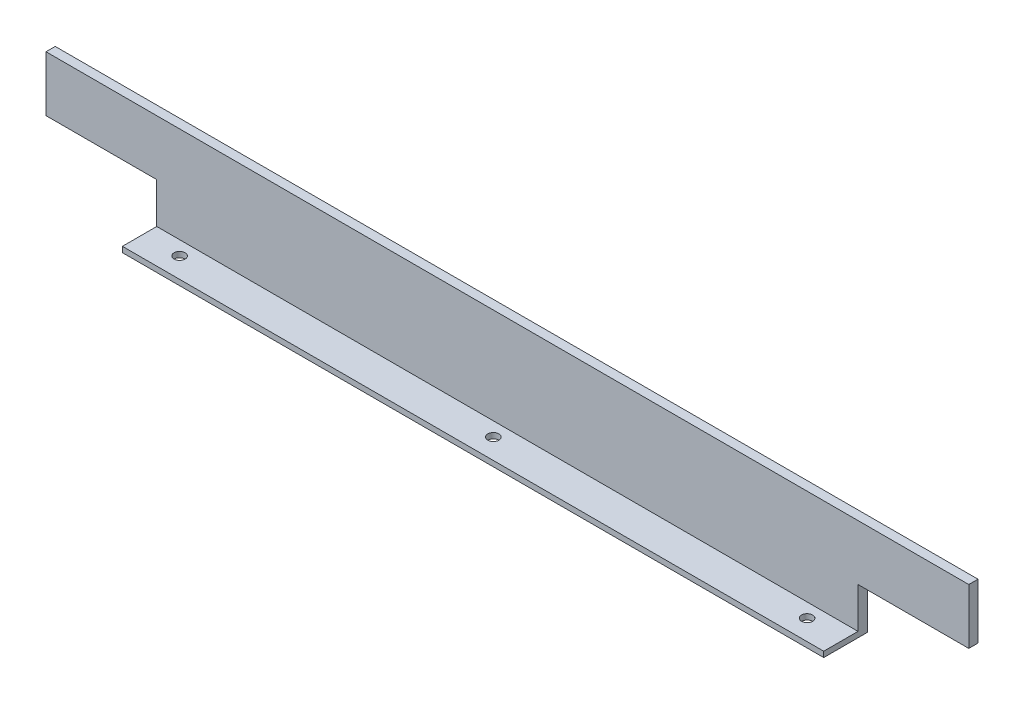
ISO-10303-21;
HEADER;
FILE_DESCRIPTION(('STEP AP214'),'2;1');
FILE_NAME('part.step','',(''),(''),'','','');
FILE_SCHEMA(('AUTOMOTIVE_DESIGN { 1 0 10303 214 1 1 1 1 }'));
ENDSEC;
DATA;
#1=APPLICATION_CONTEXT('core data for automotive mechanical design processes');
#2=APPLICATION_PROTOCOL_DEFINITION('international standard','automotive_design',2000,#1);
#3=PRODUCT_CONTEXT('',#1,'mechanical');
#4=PRODUCT('Part','Part','',(#3));
#5=PRODUCT_RELATED_PRODUCT_CATEGORY('part','',(#4));
#6=PRODUCT_DEFINITION_FORMATION('','',#4);
#7=PRODUCT_DEFINITION_CONTEXT('part definition',#1,'design');
#8=PRODUCT_DEFINITION('design','',#6,#7);
#9=PRODUCT_DEFINITION_SHAPE('','',#8);
#10=(LENGTH_UNIT() NAMED_UNIT(*) SI_UNIT(.MILLI.,.METRE.));
#11=(NAMED_UNIT(*) PLANE_ANGLE_UNIT() SI_UNIT($,.RADIAN.));
#12=(NAMED_UNIT(*) SI_UNIT($,.STERADIAN.) SOLID_ANGLE_UNIT());
#13=UNCERTAINTY_MEASURE_WITH_UNIT(LENGTH_MEASURE(1.E-05),#10,'distance_accuracy_value','');
#14=(GEOMETRIC_REPRESENTATION_CONTEXT(3) GLOBAL_UNCERTAINTY_ASSIGNED_CONTEXT((#13)) GLOBAL_UNIT_ASSIGNED_CONTEXT((#10,
#11,#12)) REPRESENTATION_CONTEXT('',''));
#15=CARTESIAN_POINT('',(0.,0.,0.));
#16=DIRECTION('',(0.,0.,1.));
#17=DIRECTION('',(1.,0.,0.));
#18=AXIS2_PLACEMENT_3D('',#15,#16,#17);
#19=CARTESIAN_POINT('',(0.,0.,5.));
#20=DIRECTION('',(0.,0.,1.));
#21=DIRECTION('',(1.,0.,0.));
#22=AXIS2_PLACEMENT_3D('',#19,#20,#21);
#23=PLANE('',#22);
#24=DIRECTION('',(0.,1.,0.));
#25=VECTOR('',#24,1.);
#26=CARTESIAN_POINT('',(-107.295597484277,92.9193461849604,5.));
#27=LINE('',#26,#25);
#28=CARTESIAN_POINT('',(-107.295597484277,95.9193461849604,5.));
#29=VERTEX_POINT('',#28);
#30=CARTESIAN_POINT('',(-107.295597484277,117.91934618496,5.));
#31=VERTEX_POINT('',#30);
#32=EDGE_CURVE('E155',#29,#31,#27,.T.);
#33=ORIENTED_EDGE('',*,*,#32,.F.);
#34=DIRECTION('',(1.,0.,0.));
#35=VECTOR('',#34,1.);
#36=CARTESIAN_POINT('',(-107.295597484277,95.9193461849604,5.));
#37=LINE('',#36,#35);
#38=CARTESIAN_POINT('',(272.704402515723,95.9193461849604,5.));
#39=VERTEX_POINT('',#38);
#40=EDGE_CURVE('E142',#29,#39,#37,.T.);
#41=ORIENTED_EDGE('',*,*,#40,.T.);
#42=DIRECTION('',(0.,-1.,0.));
#43=VECTOR('',#42,1.);
#44=CARTESIAN_POINT('',(272.704402515723,92.9193461849604,5.));
#45=LINE('',#44,#43);
#46=CARTESIAN_POINT('',(272.704402515723,117.91934618496,5.));
#47=VERTEX_POINT('',#46);
#48=EDGE_CURVE('E166',#47,#39,#45,.T.);
#49=ORIENTED_EDGE('',*,*,#48,.F.);
#50=DIRECTION('',(-1.,0.,0.));
#51=VECTOR('',#50,1.);
#52=CARTESIAN_POINT('',(332.704402515723,117.91934618496,5.));
#53=LINE('',#52,#51);
#54=CARTESIAN_POINT('',(332.704402515723,117.91934618496,5.));
#55=VERTEX_POINT('',#54);
#56=EDGE_CURVE('E163',#55,#47,#53,.T.);
#57=ORIENTED_EDGE('',*,*,#56,.F.);
#58=DIRECTION('',(0.,1.,0.));
#59=VECTOR('',#58,1.);
#60=CARTESIAN_POINT('',(332.704402515723,147.91934618496,5.));
#61=LINE('',#60,#59);
#62=CARTESIAN_POINT('',(332.704402515723,147.91934618496,5.));
#63=VERTEX_POINT('',#62);
#64=EDGE_CURVE('E203',#55,#63,#61,.T.);
#65=ORIENTED_EDGE('',*,*,#64,.T.);
#66=DIRECTION('',(-1.,0.,0.));
#67=VECTOR('',#66,1.);
#68=CARTESIAN_POINT('',(-167.295597484277,147.91934618496,5.));
#69=LINE('',#68,#67);
#70=CARTESIAN_POINT('',(-167.295597484277,147.91934618496,5.));
#71=VERTEX_POINT('',#70);
#72=EDGE_CURVE('E206',#63,#71,#69,.T.);
#73=ORIENTED_EDGE('',*,*,#72,.T.);
#74=DIRECTION('',(0.,-1.,0.));
#75=VECTOR('',#74,1.);
#76=CARTESIAN_POINT('',(-167.295597484277,147.91934618496,5.));
#77=LINE('',#76,#75);
#78=CARTESIAN_POINT('',(-167.295597484277,117.91934618496,5.));
#79=VERTEX_POINT('',#78);
#80=EDGE_CURVE('E201',#71,#79,#77,.T.);
#81=ORIENTED_EDGE('',*,*,#80,.T.);
#82=DIRECTION('',(-1.,0.,0.));
#83=VECTOR('',#82,1.);
#84=CARTESIAN_POINT('',(-167.295597484277,117.91934618496,5.));
#85=LINE('',#84,#83);
#86=EDGE_CURVE('E162',#31,#79,#85,.T.);
#87=ORIENTED_EDGE('',*,*,#86,.F.);
#88=EDGE_LOOP('',(#33,#41,#49,#57,#65,#73,#81,#87));
#89=FACE_BOUND('',#88,.T.);
#90=ADVANCED_FACE('F49',(#89),#23,.T.);
#91=CARTESIAN_POINT('',(0.,0.,0.));
#92=DIRECTION('',(0.,0.,1.));
#93=DIRECTION('',(1.,0.,0.));
#94=AXIS2_PLACEMENT_3D('',#91,#92,#93);
#95=PLANE('',#94);
#96=DIRECTION('',(1.,0.,0.));
#97=VECTOR('',#96,1.);
#98=CARTESIAN_POINT('',(332.704402515723,117.91934618496,0.));
#99=LINE('',#98,#97);
#100=CARTESIAN_POINT('',(-167.295597484277,117.91934618496,0.));
#101=VERTEX_POINT('',#100);
#102=CARTESIAN_POINT('',(-107.295597484277,117.91934618496,0.));
#103=VERTEX_POINT('',#102);
#104=EDGE_CURVE('E193',#101,#103,#99,.T.);
#105=ORIENTED_EDGE('',*,*,#104,.F.);
#106=DIRECTION('',(0.,-1.,0.));
#107=VECTOR('',#106,1.);
#108=CARTESIAN_POINT('',(-167.295597484277,147.91934618496,0.));
#109=LINE('',#108,#107);
#110=CARTESIAN_POINT('',(-167.295597484277,147.91934618496,0.));
#111=VERTEX_POINT('',#110);
#112=EDGE_CURVE('E196',#111,#101,#109,.T.);
#113=ORIENTED_EDGE('',*,*,#112,.F.);
#114=DIRECTION('',(-1.,0.,0.));
#115=VECTOR('',#114,1.);
#116=CARTESIAN_POINT('',(-167.295597484277,147.91934618496,0.));
#117=LINE('',#116,#115);
#118=CARTESIAN_POINT('',(332.704402515723,147.91934618496,0.));
#119=VERTEX_POINT('',#118);
#120=EDGE_CURVE('E204',#119,#111,#117,.T.);
#121=ORIENTED_EDGE('',*,*,#120,.F.);
#122=DIRECTION('',(0.,1.,0.));
#123=VECTOR('',#122,1.);
#124=CARTESIAN_POINT('',(332.704402515723,147.91934618496,0.));
#125=LINE('',#124,#123);
#126=CARTESIAN_POINT('',(332.704402515723,117.91934618496,0.));
#127=VERTEX_POINT('',#126);
#128=EDGE_CURVE('E214',#127,#119,#125,.T.);
#129=ORIENTED_EDGE('',*,*,#128,.F.);
#130=DIRECTION('',(-1.,0.,0.));
#131=VECTOR('',#130,1.);
#132=CARTESIAN_POINT('',(0.,117.91934618496,0.));
#133=LINE('',#132,#131);
#134=CARTESIAN_POINT('',(272.704402515723,117.91934618496,0.));
#135=VERTEX_POINT('',#134);
#136=EDGE_CURVE('E179',#127,#135,#133,.T.);
#137=ORIENTED_EDGE('',*,*,#136,.T.);
#138=EDGE_CURVE('E199',#103,#135,#99,.T.);
#139=ORIENTED_EDGE('',*,*,#138,.F.);
#140=EDGE_LOOP('',(#105,#113,#121,#129,#137,#139));
#141=FACE_BOUND('',#140,.T.);
#142=ADVANCED_FACE('F231',(#141),#95,.F.);
#143=DIRECTION('',(-1.,0.,0.));
#144=VECTOR('',#143,1.);
#145=CARTESIAN_POINT('',(332.704402515723,112.91934618496,0.));
#146=LINE('',#145,#144);
#147=CARTESIAN_POINT('',(272.704402515723,112.91934618496,0.));
#148=VERTEX_POINT('',#147);
#149=CARTESIAN_POINT('',(-107.295597484277,112.91934618496,0.));
#150=VERTEX_POINT('',#149);
#151=EDGE_CURVE('E188',#148,#150,#146,.T.);
#152=ORIENTED_EDGE('',*,*,#151,.F.);
#153=DIRECTION('',(0.,-1.,0.));
#154=VECTOR('',#153,1.);
#155=CARTESIAN_POINT('',(272.704402515723,0.,0.));
#156=LINE('',#155,#154);
#157=CARTESIAN_POINT('',(272.704402515723,92.9193461849604,0.));
#158=VERTEX_POINT('',#157);
#159=EDGE_CURVE('E185',#148,#158,#156,.T.);
#160=ORIENTED_EDGE('',*,*,#159,.T.);
#161=DIRECTION('',(1.,0.,0.));
#162=VECTOR('',#161,1.);
#163=CARTESIAN_POINT('',(-167.295597484277,92.9193461849604,0.));
#164=LINE('',#163,#162);
#165=CARTESIAN_POINT('',(-107.295597484277,92.9193461849604,0.));
#166=VERTEX_POINT('',#165);
#167=EDGE_CURVE('E211',#166,#158,#164,.T.);
#168=ORIENTED_EDGE('',*,*,#167,.F.);
#169=DIRECTION('',(0.,1.,0.));
#170=VECTOR('',#169,1.);
#171=CARTESIAN_POINT('',(-107.295597484277,0.,0.));
#172=LINE('',#171,#170);
#173=EDGE_CURVE('E175',#166,#150,#172,.T.);
#174=ORIENTED_EDGE('',*,*,#173,.T.);
#175=EDGE_LOOP('',(#152,#160,#168,#174));
#176=FACE_BOUND('',#175,.T.);
#177=ADVANCED_FACE('F280',(#176),#95,.F.);
#178=CARTESIAN_POINT('',(-167.295597484277,147.91934618496,5.));
#179=DIRECTION('',(1.,0.,0.));
#180=DIRECTION('',(0.,1.,0.));
#181=AXIS2_PLACEMENT_3D('',#178,#179,#180);
#182=PLANE('',#181);
#183=ORIENTED_EDGE('',*,*,#112,.T.);
#184=DIRECTION('',(0.,0.,1.));
#185=VECTOR('',#184,1.);
#186=CARTESIAN_POINT('',(-167.295597484277,117.91934618496,-10.));
#187=LINE('',#186,#185);
#188=EDGE_CURVE('E236',#101,#79,#187,.T.);
#189=ORIENTED_EDGE('',*,*,#188,.T.);
#190=ORIENTED_EDGE('',*,*,#80,.F.);
#191=DIRECTION('',(0.,0.,-1.));
#192=VECTOR('',#191,1.);
#193=CARTESIAN_POINT('',(-167.295597484277,147.91934618496,5.));
#194=LINE('',#193,#192);
#195=EDGE_CURVE('E208',#71,#111,#194,.T.);
#196=ORIENTED_EDGE('',*,*,#195,.T.);
#197=EDGE_LOOP('',(#183,#189,#190,#196));
#198=FACE_BOUND('',#197,.T.);
#199=ADVANCED_FACE('F51',(#198),#182,.F.);
#200=CARTESIAN_POINT('',(-167.295597484277,92.9193461849604,5.));
#201=DIRECTION('',(0.,1.,0.));
#202=DIRECTION('',(0.,0.,1.));
#203=AXIS2_PLACEMENT_3D('',#200,#201,#202);
#204=PLANE('',#203);
#205=CARTESIAN_POINT('',(-87.2955974842766,92.9193461849604,12.6));
#206=DIRECTION('',(0.,1.,0.));
#207=DIRECTION('',(0.,0.,1.));
#208=AXIS2_PLACEMENT_3D('',#205,#206,#207);
#209=CIRCLE('',#208,3.00000000000001);
#210=CARTESIAN_POINT('',(-87.2955974842766,92.9193461849604,15.6));
#211=VERTEX_POINT('',#210);
#212=EDGE_CURVE('E287',#211,#211,#209,.T.);
#213=ORIENTED_EDGE('',*,*,#212,.T.);
#214=EDGE_LOOP('',(#213));
#215=FACE_BOUND('',#214,.T.);
#216=CARTESIAN_POINT('',(82.7044025157234,92.9193461849604,12.6));
#217=DIRECTION('',(0.,1.,0.));
#218=DIRECTION('',(0.,0.,1.));
#219=AXIS2_PLACEMENT_3D('',#216,#217,#218);
#220=CIRCLE('',#219,3.00000000000001);
#221=CARTESIAN_POINT('',(82.7044025157234,92.9193461849604,15.6));
#222=VERTEX_POINT('',#221);
#223=EDGE_CURVE('E299',#222,#222,#220,.T.);
#224=ORIENTED_EDGE('',*,*,#223,.T.);
#225=EDGE_LOOP('',(#224));
#226=FACE_BOUND('',#225,.T.);
#227=CARTESIAN_POINT('',(252.704402515723,92.9193461849604,12.6));
#228=DIRECTION('',(0.,1.,0.));
#229=DIRECTION('',(0.,0.,1.));
#230=AXIS2_PLACEMENT_3D('',#227,#228,#229);
#231=CIRCLE('',#230,2.99999999999999);
#232=CARTESIAN_POINT('',(252.704402515723,92.9193461849604,15.6));
#233=VERTEX_POINT('',#232);
#234=EDGE_CURVE('E304',#233,#233,#231,.T.);
#235=ORIENTED_EDGE('',*,*,#234,.T.);
#236=EDGE_LOOP('',(#235));
#237=FACE_BOUND('',#236,.T.);
#238=ORIENTED_EDGE('',*,*,#167,.T.);
#239=DIRECTION('',(0.,0.,1.));
#240=VECTOR('',#239,1.);
#241=CARTESIAN_POINT('',(272.704402515723,92.9193461849604,-10.));
#242=LINE('',#241,#240);
#243=CARTESIAN_POINT('',(272.704402515723,92.9193461849604,23.6));
#244=VERTEX_POINT('',#243);
#245=EDGE_CURVE('E176',#158,#244,#242,.T.);
#246=ORIENTED_EDGE('',*,*,#245,.T.);
#247=DIRECTION('',(1.,0.,0.));
#248=VECTOR('',#247,1.);
#249=CARTESIAN_POINT('',(-107.295597484277,92.9193461849604,23.6));
#250=LINE('',#249,#248);
#251=CARTESIAN_POINT('',(-107.295597484277,92.9193461849604,23.6));
#252=VERTEX_POINT('',#251);
#253=EDGE_CURVE('E253',#252,#244,#250,.T.);
#254=ORIENTED_EDGE('',*,*,#253,.F.);
#255=DIRECTION('',(0.,0.,1.));
#256=VECTOR('',#255,1.);
#257=CARTESIAN_POINT('',(-107.295597484277,92.9193461849604,-10.));
#258=LINE('',#257,#256);
#259=EDGE_CURVE('E168',#166,#252,#258,.T.);
#260=ORIENTED_EDGE('',*,*,#259,.F.);
#261=EDGE_LOOP('',(#238,#246,#254,#260));
#262=FACE_BOUND('',#261,.T.);
#263=ADVANCED_FACE('F283',(#215,#226,#237,#262),#204,.F.);
#264=CARTESIAN_POINT('',(332.704402515723,147.91934618496,5.));
#265=DIRECTION('',(-1.,0.,0.));
#266=DIRECTION('',(0.,0.,1.));
#267=AXIS2_PLACEMENT_3D('',#264,#265,#266);
#268=PLANE('',#267);
#269=ORIENTED_EDGE('',*,*,#64,.F.);
#270=DIRECTION('',(0.,0.,1.));
#271=VECTOR('',#270,1.);
#272=CARTESIAN_POINT('',(332.704402515723,117.91934618496,-10.));
#273=LINE('',#272,#271);
#274=EDGE_CURVE('E240',#127,#55,#273,.T.);
#275=ORIENTED_EDGE('',*,*,#274,.F.);
#276=ORIENTED_EDGE('',*,*,#128,.T.);
#277=DIRECTION('',(0.,0.,-1.));
#278=VECTOR('',#277,1.);
#279=CARTESIAN_POINT('',(332.704402515723,147.91934618496,5.));
#280=LINE('',#279,#278);
#281=EDGE_CURVE('E57',#63,#119,#280,.T.);
#282=ORIENTED_EDGE('',*,*,#281,.F.);
#283=EDGE_LOOP('',(#269,#275,#276,#282));
#284=FACE_BOUND('',#283,.T.);
#285=ADVANCED_FACE('F239',(#284),#268,.F.);
#286=CARTESIAN_POINT('',(-167.295597484277,147.91934618496,5.));
#287=DIRECTION('',(0.,-1.,0.));
#288=DIRECTION('',(0.,0.,-1.));
#289=AXIS2_PLACEMENT_3D('',#286,#287,#288);
#290=PLANE('',#289);
#291=ORIENTED_EDGE('',*,*,#120,.T.);
#292=ORIENTED_EDGE('',*,*,#195,.F.);
#293=ORIENTED_EDGE('',*,*,#72,.F.);
#294=ORIENTED_EDGE('',*,*,#281,.T.);
#295=EDGE_LOOP('',(#291,#292,#293,#294));
#296=FACE_BOUND('',#295,.T.);
#297=ADVANCED_FACE('F223',(#296),#290,.F.);
#298=CARTESIAN_POINT('',(332.704402515723,112.91934618496,-10.));
#299=DIRECTION('',(0.,1.,0.));
#300=DIRECTION('',(0.,0.,1.));
#301=AXIS2_PLACEMENT_3D('',#298,#299,#300);
#302=PLANE('',#301);
#303=DIRECTION('',(-1.,0.,0.));
#304=VECTOR('',#303,1.);
#305=CARTESIAN_POINT('',(332.704402515723,112.91934618496,-10.));
#306=LINE('',#305,#304);
#307=CARTESIAN_POINT('',(272.704402515723,112.91934618496,-10.));
#308=VERTEX_POINT('',#307);
#309=CARTESIAN_POINT('',(-107.295597484277,112.91934618496,-10.));
#310=VERTEX_POINT('',#309);
#311=EDGE_CURVE('E189',#308,#310,#306,.T.);
#312=ORIENTED_EDGE('',*,*,#311,.F.);
#313=DIRECTION('',(0.,0.,1.));
#314=VECTOR('',#313,1.);
#315=CARTESIAN_POINT('',(272.704402515723,112.91934618496,-10.));
#316=LINE('',#315,#314);
#317=EDGE_CURVE('E182',#308,#148,#316,.T.);
#318=ORIENTED_EDGE('',*,*,#317,.T.);
#319=ORIENTED_EDGE('',*,*,#151,.T.);
#320=DIRECTION('',(0.,0.,-1.));
#321=VECTOR('',#320,1.);
#322=CARTESIAN_POINT('',(-107.295597484277,112.91934618496,-10.));
#323=LINE('',#322,#321);
#324=EDGE_CURVE('E172',#150,#310,#323,.T.);
#325=ORIENTED_EDGE('',*,*,#324,.T.);
#326=EDGE_LOOP('',(#312,#318,#319,#325));
#327=FACE_BOUND('',#326,.T.);
#328=ADVANCED_FACE('F277',(#327),#302,.F.);
#329=CARTESIAN_POINT('',(332.704402515723,117.91934618496,-10.));
#330=DIRECTION('',(0.,-1.,0.));
#331=DIRECTION('',(0.,0.,-1.));
#332=AXIS2_PLACEMENT_3D('',#329,#330,#331);
#333=PLANE('',#332);
#334=ORIENTED_EDGE('',*,*,#138,.T.);
#335=DIRECTION('',(0.,0.,1.));
#336=VECTOR('',#335,1.);
#337=CARTESIAN_POINT('',(272.704402515723,117.91934618496,-10.));
#338=LINE('',#337,#336);
#339=CARTESIAN_POINT('',(272.704402515723,117.91934618496,-10.));
#340=VERTEX_POINT('',#339);
#341=EDGE_CURVE('E245',#340,#135,#338,.T.);
#342=ORIENTED_EDGE('',*,*,#341,.F.);
#343=DIRECTION('',(1.,0.,0.));
#344=VECTOR('',#343,1.);
#345=CARTESIAN_POINT('',(332.704402515723,117.91934618496,-10.));
#346=LINE('',#345,#344);
#347=CARTESIAN_POINT('',(-107.295597484277,117.91934618496,-10.));
#348=VERTEX_POINT('',#347);
#349=EDGE_CURVE('E192',#348,#340,#346,.T.);
#350=ORIENTED_EDGE('',*,*,#349,.F.);
#351=DIRECTION('',(0.,0.,1.));
#352=VECTOR('',#351,1.);
#353=CARTESIAN_POINT('',(-107.295597484277,117.91934618496,-10.));
#354=LINE('',#353,#352);
#355=EDGE_CURVE('E71',#348,#103,#354,.T.);
#356=ORIENTED_EDGE('',*,*,#355,.T.);
#357=EDGE_LOOP('',(#334,#342,#350,#356));
#358=FACE_BOUND('',#357,.T.);
#359=ADVANCED_FACE('F272',(#358),#333,.F.);
#360=CARTESIAN_POINT('',(0.,0.,-10.));
#361=DIRECTION('',(0.,0.,-1.));
#362=DIRECTION('',(-1.,0.,0.));
#363=AXIS2_PLACEMENT_3D('',#360,#361,#362);
#364=PLANE('',#363);
#365=DIRECTION('',(0.,-1.,0.));
#366=VECTOR('',#365,1.);
#367=CARTESIAN_POINT('',(272.704402515723,92.9193461849604,-10.));
#368=LINE('',#367,#366);
#369=EDGE_CURVE('E243',#340,#308,#368,.T.);
#370=ORIENTED_EDGE('',*,*,#369,.T.);
#371=ORIENTED_EDGE('',*,*,#311,.T.);
#372=DIRECTION('',(0.,-1.,0.));
#373=VECTOR('',#372,1.);
#374=CARTESIAN_POINT('',(-107.295597484277,0.,-10.));
#375=LINE('',#374,#373);
#376=EDGE_CURVE('E11',#348,#310,#375,.T.);
#377=ORIENTED_EDGE('',*,*,#376,.F.);
#378=ORIENTED_EDGE('',*,*,#349,.T.);
#379=EDGE_LOOP('',(#370,#371,#377,#378));
#380=FACE_BOUND('',#379,.T.);
#381=ADVANCED_FACE('F274',(#380),#364,.T.);
#382=CARTESIAN_POINT('',(-167.295597484277,117.91934618496,-10.));
#383=DIRECTION('',(0.,1.,0.));
#384=DIRECTION('',(0.,0.,1.));
#385=AXIS2_PLACEMENT_3D('',#382,#383,#384);
#386=PLANE('',#385);
#387=EDGE_CURVE('E252',#103,#31,#354,.T.);
#388=ORIENTED_EDGE('',*,*,#387,.T.);
#389=ORIENTED_EDGE('',*,*,#86,.T.);
#390=ORIENTED_EDGE('',*,*,#188,.F.);
#391=ORIENTED_EDGE('',*,*,#104,.T.);
#392=EDGE_LOOP('',(#388,#389,#390,#391));
#393=FACE_BOUND('',#392,.T.);
#394=ADVANCED_FACE('F399',(#393),#386,.F.);
#395=CARTESIAN_POINT('',(-107.295597484277,92.9193461849604,-10.));
#396=DIRECTION('',(1.,0.,0.));
#397=DIRECTION('',(0.,0.,-1.));
#398=AXIS2_PLACEMENT_3D('',#395,#396,#397);
#399=PLANE('',#398);
#400=ORIENTED_EDGE('',*,*,#259,.T.);
#401=DIRECTION('',(0.,-1.,0.));
#402=VECTOR('',#401,1.);
#403=CARTESIAN_POINT('',(-107.295597484277,92.9193461849604,23.6));
#404=LINE('',#403,#402);
#405=CARTESIAN_POINT('',(-107.295597484277,95.9193461849604,23.6));
#406=VERTEX_POINT('',#405);
#407=EDGE_CURVE('E151',#406,#252,#404,.T.);
#408=ORIENTED_EDGE('',*,*,#407,.F.);
#409=DIRECTION('',(0.,0.,1.));
#410=VECTOR('',#409,1.);
#411=CARTESIAN_POINT('',(-107.295597484277,95.9193461849604,5.));
#412=LINE('',#411,#410);
#413=EDGE_CURVE('E145',#29,#406,#412,.T.);
#414=ORIENTED_EDGE('',*,*,#413,.F.);
#415=ORIENTED_EDGE('',*,*,#32,.T.);
#416=ORIENTED_EDGE('',*,*,#387,.F.);
#417=ORIENTED_EDGE('',*,*,#355,.F.);
#418=ORIENTED_EDGE('',*,*,#376,.T.);
#419=ORIENTED_EDGE('',*,*,#324,.F.);
#420=ORIENTED_EDGE('',*,*,#173,.F.);
#421=EDGE_LOOP('',(#400,#408,#414,#415,#416,#417,#418,#419,#420));
#422=FACE_BOUND('',#421,.T.);
#423=ADVANCED_FACE('F154',(#422),#399,.F.);
#424=CARTESIAN_POINT('',(272.704402515723,92.9193461849604,-10.));
#425=DIRECTION('',(-1.,0.,0.));
#426=DIRECTION('',(0.,0.,1.));
#427=AXIS2_PLACEMENT_3D('',#424,#425,#426);
#428=PLANE('',#427);
#429=ORIENTED_EDGE('',*,*,#317,.F.);
#430=ORIENTED_EDGE('',*,*,#369,.F.);
#431=ORIENTED_EDGE('',*,*,#341,.T.);
#432=EDGE_CURVE('E242',#135,#47,#338,.T.);
#433=ORIENTED_EDGE('',*,*,#432,.T.);
#434=ORIENTED_EDGE('',*,*,#48,.T.);
#435=DIRECTION('',(0.,0.,1.));
#436=VECTOR('',#435,1.);
#437=CARTESIAN_POINT('',(272.704402515723,95.9193461849604,5.));
#438=LINE('',#437,#436);
#439=CARTESIAN_POINT('',(272.704402515723,95.9193461849604,23.6));
#440=VERTEX_POINT('',#439);
#441=EDGE_CURVE('E64',#39,#440,#438,.T.);
#442=ORIENTED_EDGE('',*,*,#441,.T.);
#443=DIRECTION('',(0.,-1.,0.));
#444=VECTOR('',#443,1.);
#445=CARTESIAN_POINT('',(272.704402515723,92.9193461849604,23.6));
#446=LINE('',#445,#444);
#447=EDGE_CURVE('E158',#440,#244,#446,.T.);
#448=ORIENTED_EDGE('',*,*,#447,.T.);
#449=ORIENTED_EDGE('',*,*,#245,.F.);
#450=ORIENTED_EDGE('',*,*,#159,.F.);
#451=EDGE_LOOP('',(#429,#430,#431,#433,#434,#442,#448,#449,#450));
#452=FACE_BOUND('',#451,.T.);
#453=ADVANCED_FACE('F268',(#452),#428,.F.);
#454=CARTESIAN_POINT('',(332.704402515723,117.91934618496,-10.));
#455=DIRECTION('',(0.,1.,0.));
#456=DIRECTION('',(0.,0.,1.));
#457=AXIS2_PLACEMENT_3D('',#454,#455,#456);
#458=PLANE('',#457);
#459=ORIENTED_EDGE('',*,*,#274,.T.);
#460=ORIENTED_EDGE('',*,*,#56,.T.);
#461=ORIENTED_EDGE('',*,*,#432,.F.);
#462=ORIENTED_EDGE('',*,*,#136,.F.);
#463=EDGE_LOOP('',(#459,#460,#461,#462));
#464=FACE_BOUND('',#463,.T.);
#465=ADVANCED_FACE('F323',(#464),#458,.F.);
#466=CARTESIAN_POINT('',(-107.295597484277,92.9193461849604,23.6));
#467=DIRECTION('',(0.,0.,1.));
#468=DIRECTION('',(1.,0.,0.));
#469=AXIS2_PLACEMENT_3D('',#466,#467,#468);
#470=PLANE('',#469);
#471=ORIENTED_EDGE('',*,*,#447,.F.);
#472=DIRECTION('',(1.,0.,0.));
#473=VECTOR('',#472,1.);
#474=CARTESIAN_POINT('',(-107.295597484277,95.9193461849604,23.6));
#475=LINE('',#474,#473);
#476=EDGE_CURVE('E150',#406,#440,#475,.T.);
#477=ORIENTED_EDGE('',*,*,#476,.F.);
#478=ORIENTED_EDGE('',*,*,#407,.T.);
#479=ORIENTED_EDGE('',*,*,#253,.T.);
#480=EDGE_LOOP('',(#471,#477,#478,#479));
#481=FACE_BOUND('',#480,.T.);
#482=ADVANCED_FACE('F284',(#481),#470,.T.);
#483=CARTESIAN_POINT('',(-107.295597484277,95.9193461849604,5.));
#484=DIRECTION('',(0.,1.,0.));
#485=DIRECTION('',(0.,0.,1.));
#486=AXIS2_PLACEMENT_3D('',#483,#484,#485);
#487=PLANE('',#486);
#488=CARTESIAN_POINT('',(-87.2955974842766,95.9193461849604,12.6));
#489=DIRECTION('',(0.,1.,0.));
#490=DIRECTION('',(0.,0.,1.));
#491=AXIS2_PLACEMENT_3D('',#488,#489,#490);
#492=CIRCLE('',#491,3.00000000000001);
#493=CARTESIAN_POINT('',(-87.2955974842766,95.9193461849604,15.6));
#494=VERTEX_POINT('',#493);
#495=EDGE_CURVE('E289',#494,#494,#492,.T.);
#496=ORIENTED_EDGE('',*,*,#495,.F.);
#497=EDGE_LOOP('',(#496));
#498=FACE_BOUND('',#497,.T.);
#499=CARTESIAN_POINT('',(82.7044025157234,95.9193461849604,12.6));
#500=DIRECTION('',(0.,1.,0.));
#501=DIRECTION('',(0.,0.,1.));
#502=AXIS2_PLACEMENT_3D('',#499,#500,#501);
#503=CIRCLE('',#502,3.00000000000001);
#504=CARTESIAN_POINT('',(82.7044025157234,95.9193461849604,15.6));
#505=VERTEX_POINT('',#504);
#506=EDGE_CURVE('E294',#505,#505,#503,.T.);
#507=ORIENTED_EDGE('',*,*,#506,.F.);
#508=EDGE_LOOP('',(#507));
#509=FACE_BOUND('',#508,.T.);
#510=CARTESIAN_POINT('',(252.704402515723,95.9193461849604,12.6));
#511=DIRECTION('',(0.,1.,0.));
#512=DIRECTION('',(0.,0.,1.));
#513=AXIS2_PLACEMENT_3D('',#510,#511,#512);
#514=CIRCLE('',#513,2.99999999999999);
#515=CARTESIAN_POINT('',(252.704402515723,95.9193461849604,15.6));
#516=VERTEX_POINT('',#515);
#517=EDGE_CURVE('E302',#516,#516,#514,.T.);
#518=ORIENTED_EDGE('',*,*,#517,.F.);
#519=EDGE_LOOP('',(#518));
#520=FACE_BOUND('',#519,.T.);
#521=ORIENTED_EDGE('',*,*,#441,.F.);
#522=ORIENTED_EDGE('',*,*,#40,.F.);
#523=ORIENTED_EDGE('',*,*,#413,.T.);
#524=ORIENTED_EDGE('',*,*,#476,.T.);
#525=EDGE_LOOP('',(#521,#522,#523,#524));
#526=FACE_BOUND('',#525,.T.);
#527=ADVANCED_FACE('F144',(#498,#509,#520,#526),#487,.T.);
#528=CARTESIAN_POINT('',(252.704402515723,92.9193461849604,12.6));
#529=DIRECTION('',(0.,1.,0.));
#530=DIRECTION('',(0.,0.,1.));
#531=AXIS2_PLACEMENT_3D('',#528,#529,#530);
#532=CYLINDRICAL_SURFACE('',#531,2.99999999999999);
#533=ORIENTED_EDGE('',*,*,#234,.F.);
#534=EDGE_LOOP('',(#533));
#535=FACE_BOUND('',#534,.T.);
#536=ORIENTED_EDGE('',*,*,#517,.T.);
#537=EDGE_LOOP('',(#536));
#538=FACE_BOUND('',#537,.T.);
#539=ADVANCED_FACE('F309',(#535,#538),#532,.F.);
#540=CARTESIAN_POINT('',(82.7044025157234,92.9193461849604,12.6));
#541=DIRECTION('',(0.,1.,0.));
#542=DIRECTION('',(0.,0.,1.));
#543=AXIS2_PLACEMENT_3D('',#540,#541,#542);
#544=CYLINDRICAL_SURFACE('',#543,3.00000000000001);
#545=ORIENTED_EDGE('',*,*,#223,.F.);
#546=EDGE_LOOP('',(#545));
#547=FACE_BOUND('',#546,.T.);
#548=ORIENTED_EDGE('',*,*,#506,.T.);
#549=EDGE_LOOP('',(#548));
#550=FACE_BOUND('',#549,.T.);
#551=ADVANCED_FACE('F312',(#547,#550),#544,.F.);
#552=CARTESIAN_POINT('',(-87.2955974842766,92.9193461849604,12.6));
#553=DIRECTION('',(0.,1.,0.));
#554=DIRECTION('',(0.,0.,1.));
#555=AXIS2_PLACEMENT_3D('',#552,#553,#554);
#556=CYLINDRICAL_SURFACE('',#555,3.00000000000001);
#557=ORIENTED_EDGE('',*,*,#212,.F.);
#558=EDGE_LOOP('',(#557));
#559=FACE_BOUND('',#558,.T.);
#560=ORIENTED_EDGE('',*,*,#495,.T.);
#561=EDGE_LOOP('',(#560));
#562=FACE_BOUND('',#561,.T.);
#563=ADVANCED_FACE('F350',(#559,#562),#556,.F.);
#564=CLOSED_SHELL('',(#90,#142,#177,#199,#263,#285,#297,#328,#359,#381,#394,#423,#453,#465,#482,
#527,#539,#551,#563));
#565=MANIFOLD_SOLID_BREP('B2',#564);
#566=ADVANCED_BREP_SHAPE_REPRESENTATION('',(#18,#565),#14);
#567=SHAPE_DEFINITION_REPRESENTATION(#9,#566);
ENDSEC;
END-ISO-10303-21;
